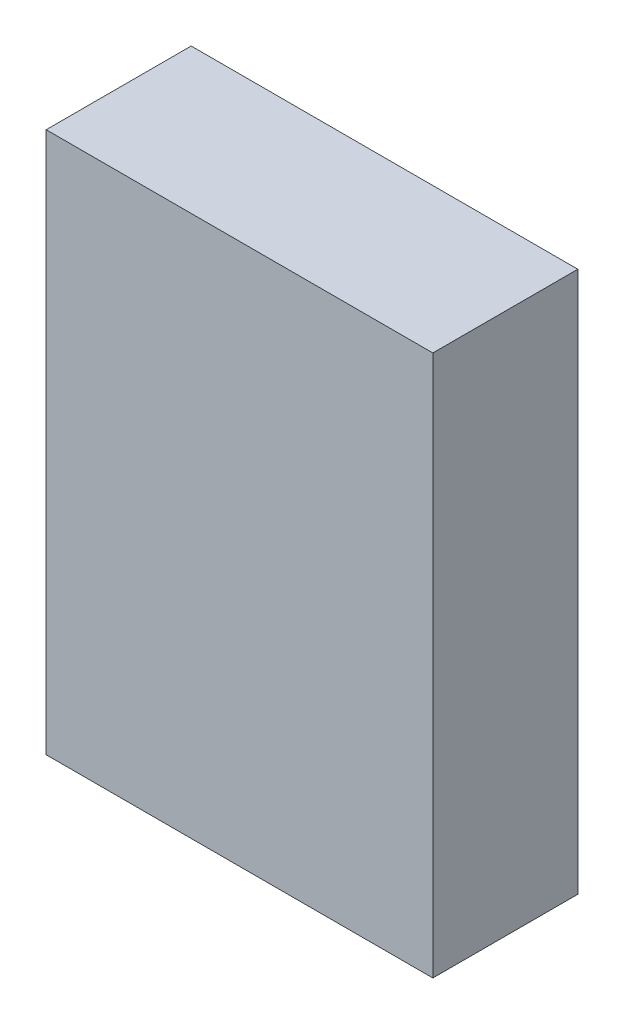
ISO-10303-21;
HEADER;
FILE_DESCRIPTION(('STEP AP214'),'2;1');
FILE_NAME('part.step','',(''),(''),'','','');
FILE_SCHEMA(('AUTOMOTIVE_DESIGN { 1 0 10303 214 1 1 1 1 }'));
ENDSEC;
DATA;
#1=APPLICATION_CONTEXT('core data for automotive mechanical design processes');
#2=APPLICATION_PROTOCOL_DEFINITION('international standard','automotive_design',2000,#1);
#3=PRODUCT_CONTEXT('',#1,'mechanical');
#4=PRODUCT('Part','Part','',(#3));
#5=PRODUCT_RELATED_PRODUCT_CATEGORY('part','',(#4));
#6=PRODUCT_DEFINITION_FORMATION('','',#4);
#7=PRODUCT_DEFINITION_CONTEXT('part definition',#1,'design');
#8=PRODUCT_DEFINITION('design','',#6,#7);
#9=PRODUCT_DEFINITION_SHAPE('','',#8);
#10=(LENGTH_UNIT() NAMED_UNIT(*) SI_UNIT(.MILLI.,.METRE.));
#11=(NAMED_UNIT(*) PLANE_ANGLE_UNIT() SI_UNIT($,.RADIAN.));
#12=(NAMED_UNIT(*) SI_UNIT($,.STERADIAN.) SOLID_ANGLE_UNIT());
#13=UNCERTAINTY_MEASURE_WITH_UNIT(LENGTH_MEASURE(1.E-05),#10,'distance_accuracy_value','');
#14=(GEOMETRIC_REPRESENTATION_CONTEXT(3) GLOBAL_UNCERTAINTY_ASSIGNED_CONTEXT((#13)) GLOBAL_UNIT_ASSIGNED_CONTEXT((#10,
#11,#12)) REPRESENTATION_CONTEXT('',''));
#15=CARTESIAN_POINT('',(0.,0.,0.));
#16=DIRECTION('',(0.,0.,1.));
#17=DIRECTION('',(1.,0.,0.));
#18=AXIS2_PLACEMENT_3D('',#15,#16,#17);
#19=CARTESIAN_POINT('',(11.6522019236003,-16.4030324770231,-0.164999176045936));
#20=CARTESIAN_POINT('',(11.6522018648521,-17.0750324770232,-0.164999234794013));
#21=CARTESIAN_POINT('',(11.6522019236003,-16.4030324927592,0.0150008239540631));
#22=CARTESIAN_POINT('',(11.6522018648521,-17.0750324927593,0.0150007652059859));
#23=(BOUNDED_SURFACE() B_SPLINE_SURFACE(1,1,((#19,#20),(#21,#22)),.UNSPECIFIED.,.F.,.F.,
.F.) B_SPLINE_SURFACE_WITH_KNOTS((2,2),(2,2),(-1.50000000000005E-05,0.000165),
(-0.000336000000000014,0.000336),
.UNSPECIFIED.) GEOMETRIC_REPRESENTATION_ITEM() RATIONAL_B_SPLINE_SURFACE(((1.,1.),(1.,1.))) REPRESENTATION_ITEM('') SURFACE());
#24=CARTESIAN_POINT('',(11.6522018697478,-17.0190324914479,7.70101659103158E-07));
#25=CARTESIAN_POINT('',(11.6522019187046,-16.4590324914479,8.19058390110066E-07));
#26=(BOUNDED_CURVE() B_SPLINE_CURVE(1,(#24,#25),.UNSPECIFIED.,.F.,
.F.) B_SPLINE_CURVE_WITH_KNOTS((2,2),(-0.00028,0.00028),
.UNSPECIFIED.) CURVE() GEOMETRIC_REPRESENTATION_ITEM() RATIONAL_B_SPLINE_CURVE((1.,1.)) REPRESENTATION_ITEM(''));
#27=CARTESIAN_POINT('',(11.6522018697479,-17.0190324914479,7.70101659091499E-07));
#28=VERTEX_POINT('',#27);
#29=CARTESIAN_POINT('',(11.6522019187046,-16.4590324914479,8.19058390121724E-07));
#30=VERTEX_POINT('',#29);
#31=EDGE_CURVE('E97',#28,#30,#26,.T.);
#32=CARTESIAN_POINT('',(11.6522018697479,-17.0190324783345,-0.14999922989834));
#33=CARTESIAN_POINT('',(11.6522018697479,-17.0190324914479,7.70101659056804E-07));
#34=(BOUNDED_CURVE() B_SPLINE_CURVE(1,(#32,#33),.UNSPECIFIED.,.F.,
.F.) B_SPLINE_CURVE_WITH_KNOTS((2,2),(0.,0.00015),
.UNSPECIFIED.) CURVE() GEOMETRIC_REPRESENTATION_ITEM() RATIONAL_B_SPLINE_CURVE((1.,1.)) REPRESENTATION_ITEM(''));
#35=CARTESIAN_POINT('',(11.6522018697479,-17.0190324783345,-0.14999922989834));
#36=VERTEX_POINT('',#35);
#37=EDGE_CURVE('E11',#36,#28,#34,.T.);
#38=CARTESIAN_POINT('',(11.6522018697478,-17.0190324783345,-0.149999229898339));
#39=CARTESIAN_POINT('',(11.6522019187046,-16.4590324783345,-0.149999180941608));
#40=(BOUNDED_CURVE() B_SPLINE_CURVE(1,(#38,#39),.UNSPECIFIED.,.F.,
.F.) B_SPLINE_CURVE_WITH_KNOTS((2,2),(-0.00028,0.00028),
.UNSPECIFIED.) CURVE() GEOMETRIC_REPRESENTATION_ITEM() RATIONAL_B_SPLINE_CURVE((1.,1.)) REPRESENTATION_ITEM(''));
#41=CARTESIAN_POINT('',(11.6522019187046,-16.4590324783345,-0.149999180941609));
#42=VERTEX_POINT('',#41);
#43=EDGE_CURVE('E78',#36,#42,#40,.T.);
#44=CARTESIAN_POINT('',(11.6522019187046,-16.4590324783345,-0.149999180941609));
#45=CARTESIAN_POINT('',(11.6522019187046,-16.4590324914479,8.19058390104377E-07));
#46=(BOUNDED_CURVE() B_SPLINE_CURVE(1,(#44,#45),.UNSPECIFIED.,.F.,
.F.) B_SPLINE_CURVE_WITH_KNOTS((2,2),(0.,0.00015),
.UNSPECIFIED.) CURVE() GEOMETRIC_REPRESENTATION_ITEM() RATIONAL_B_SPLINE_CURVE((1.,1.)) REPRESENTATION_ITEM(''));
#47=EDGE_CURVE('E22',#42,#30,#46,.T.);
#48=ORIENTED_EDGE('',*,*,#31,.F.);
#49=ORIENTED_EDGE('',*,*,#37,.F.);
#50=ORIENTED_EDGE('',*,*,#43,.T.);
#51=ORIENTED_EDGE('',*,*,#47,.T.);
#52=EDGE_LOOP('',(#48,#49,#50,#51));
#53=FACE_BOUND('',#52,.T.);
#54=ADVANCED_FACE('F17',(#53),#23,.T.);
#55=CARTESIAN_POINT('',(11.2122018697479,-17.0190324542932,0.0150007701016626));
#56=CARTESIAN_POINT('',(11.6922018697479,-17.0190324962561,0.015000770101659));
#57=CARTESIAN_POINT('',(11.2122018697479,-17.0190324385571,-0.164999229898337));
#58=CARTESIAN_POINT('',(11.6922018697479,-17.01903248052,-0.164999229898341));
#59=(BOUNDED_SURFACE() B_SPLINE_SURFACE(1,1,((#55,#56),(#57,#58)),.UNSPECIFIED.,.F.,.F.,
.F.) B_SPLINE_SURFACE_WITH_KNOTS((2,2),(2,2),(-1.5E-05,0.000165),(-0.000240000000000003,
0.00024),.UNSPECIFIED.) GEOMETRIC_REPRESENTATION_ITEM() RATIONAL_B_SPLINE_SURFACE(((1.,1.),(1.,1.))) REPRESENTATION_ITEM('') SURFACE());
#60=CARTESIAN_POINT('',(11.6522018697479,-17.019032491448,7.70101659297674E-07));
#61=CARTESIAN_POINT('',(11.2522018697479,-17.0190324564788,7.7010166235477E-07));
#62=(BOUNDED_CURVE() B_SPLINE_CURVE(1,(#60,#61),.UNSPECIFIED.,.F.,
.F.) B_SPLINE_CURVE_WITH_KNOTS((2,2),(-0.0002,0.0002),
.UNSPECIFIED.) CURVE() GEOMETRIC_REPRESENTATION_ITEM() RATIONAL_B_SPLINE_CURVE((1.,1.)) REPRESENTATION_ITEM(''));
#63=CARTESIAN_POINT('',(11.2522018697479,-17.0190324564788,7.70101662127265E-07));
#64=VERTEX_POINT('',#63);
#65=EDGE_CURVE('E84',#28,#64,#62,.T.);
#66=CARTESIAN_POINT('',(11.2522018697479,-17.0190324433654,-0.149999229898337));
#67=CARTESIAN_POINT('',(11.2522018697479,-17.0190324564788,7.70101662109918E-07));
#68=(BOUNDED_CURVE() B_SPLINE_CURVE(1,(#66,#67),.UNSPECIFIED.,.F.,
.F.) B_SPLINE_CURVE_WITH_KNOTS((2,2),(0.,0.00015),
.UNSPECIFIED.) CURVE() GEOMETRIC_REPRESENTATION_ITEM() RATIONAL_B_SPLINE_CURVE((1.,1.)) REPRESENTATION_ITEM(''));
#69=CARTESIAN_POINT('',(11.2522018697479,-17.0190324433654,-0.149999229898337));
#70=VERTEX_POINT('',#69);
#71=EDGE_CURVE('E31',#70,#64,#68,.T.);
#72=CARTESIAN_POINT('',(11.6522018697479,-17.0190324783345,-0.149999229898341));
#73=CARTESIAN_POINT('',(11.2522018697479,-17.0190324433653,-0.149999229898337));
#74=(BOUNDED_CURVE() B_SPLINE_CURVE(1,(#72,#73),.UNSPECIFIED.,.F.,
.F.) B_SPLINE_CURVE_WITH_KNOTS((2,2),(-0.0002,0.0002),
.UNSPECIFIED.) CURVE() GEOMETRIC_REPRESENTATION_ITEM() RATIONAL_B_SPLINE_CURVE((1.,1.)) REPRESENTATION_ITEM(''));
#75=EDGE_CURVE('E83',#36,#70,#74,.T.);
#76=ORIENTED_EDGE('',*,*,#65,.T.);
#77=ORIENTED_EDGE('',*,*,#71,.F.);
#78=ORIENTED_EDGE('',*,*,#75,.F.);
#79=ORIENTED_EDGE('',*,*,#37,.T.);
#80=EDGE_LOOP('',(#76,#77,#78,#79));
#81=FACE_BOUND('',#80,.T.);
#82=ADVANCED_FACE('F144',(#81),#59,.T.);
#83=CARTESIAN_POINT('',(11.2522019236003,-16.4030324577901,0.0150008239540662));
#84=CARTESIAN_POINT('',(11.2522018648521,-17.0750324577902,0.015000765205989));
#85=CARTESIAN_POINT('',(11.2522019236003,-16.4030324420541,-0.164999176045933));
#86=CARTESIAN_POINT('',(11.2522018648521,-17.0750324420541,-0.16499923479401));
#87=(BOUNDED_SURFACE() B_SPLINE_SURFACE(1,1,((#83,#84),(#85,#86)),.UNSPECIFIED.,.F.,.F.,
.F.) B_SPLINE_SURFACE_WITH_KNOTS((2,2),(2,2),(-1.50000000000005E-05,0.000165),
(-0.000336000000000012,0.000336000000000004),
.UNSPECIFIED.) GEOMETRIC_REPRESENTATION_ITEM() RATIONAL_B_SPLINE_SURFACE(((1.,1.),(1.,1.))) REPRESENTATION_ITEM('') SURFACE());
#88=CARTESIAN_POINT('',(11.2522018697478,-17.0190324564788,7.70101662138923E-07));
#89=CARTESIAN_POINT('',(11.2522019187046,-16.4590324564788,8.19058393145832E-07));
#90=(BOUNDED_CURVE() B_SPLINE_CURVE(1,(#88,#89),.UNSPECIFIED.,.F.,
.F.) B_SPLINE_CURVE_WITH_KNOTS((2,2),(-0.00028,0.00028),
.UNSPECIFIED.) CURVE() GEOMETRIC_REPRESENTATION_ITEM() RATIONAL_B_SPLINE_CURVE((1.,1.)) REPRESENTATION_ITEM(''));
#91=CARTESIAN_POINT('',(11.2522019187046,-16.4590324564788,8.1905839315749E-07));
#92=VERTEX_POINT('',#91);
#93=EDGE_CURVE('E92',#64,#92,#90,.T.);
#94=CARTESIAN_POINT('',(11.2522019187046,-16.4590324433654,-0.149999180941606));
#95=CARTESIAN_POINT('',(11.2522019187046,-16.4590324564788,8.19058393122796E-07));
#96=(BOUNDED_CURVE() B_SPLINE_CURVE(1,(#94,#95),.UNSPECIFIED.,.F.,
.F.) B_SPLINE_CURVE_WITH_KNOTS((2,2),(0.,0.00015),
.UNSPECIFIED.) CURVE() GEOMETRIC_REPRESENTATION_ITEM() RATIONAL_B_SPLINE_CURVE((1.,1.)) REPRESENTATION_ITEM(''));
#97=CARTESIAN_POINT('',(11.2522019187046,-16.4590324433654,-0.149999180941606));
#98=VERTEX_POINT('',#97);
#99=EDGE_CURVE('E40',#98,#92,#96,.T.);
#100=CARTESIAN_POINT('',(11.2522018697478,-17.0190324433654,-0.149999229898336));
#101=CARTESIAN_POINT('',(11.2522019187046,-16.4590324433654,-0.149999180941605));
#102=(BOUNDED_CURVE() B_SPLINE_CURVE(1,(#100,#101),.UNSPECIFIED.,.F.,
.F.) B_SPLINE_CURVE_WITH_KNOTS((2,2),(-0.00028,0.00028),
.UNSPECIFIED.) CURVE() GEOMETRIC_REPRESENTATION_ITEM() RATIONAL_B_SPLINE_CURVE((1.,1.)) REPRESENTATION_ITEM(''));
#103=EDGE_CURVE('E79',#70,#98,#102,.T.);
#104=ORIENTED_EDGE('',*,*,#93,.T.);
#105=ORIENTED_EDGE('',*,*,#99,.F.);
#106=ORIENTED_EDGE('',*,*,#103,.F.);
#107=ORIENTED_EDGE('',*,*,#71,.T.);
#108=EDGE_LOOP('',(#104,#105,#106,#107));
#109=FACE_BOUND('',#108,.T.);
#110=ADVANCED_FACE('F145',(#109),#87,.T.);
#111=CARTESIAN_POINT('',(11.2122019187046,-16.4590324385571,-0.164999180941606));
#112=CARTESIAN_POINT('',(11.6922019187046,-16.45903248052,-0.16499918094161));
#113=CARTESIAN_POINT('',(11.2122019187046,-16.4590324542932,0.0150008190583937));
#114=CARTESIAN_POINT('',(11.6922019187046,-16.4590324962561,0.01500081905839));
#115=(BOUNDED_SURFACE() B_SPLINE_SURFACE(1,1,((#111,#112),(#113,#114)),.UNSPECIFIED.,.F.,.F.,
.F.) B_SPLINE_SURFACE_WITH_KNOTS((2,2),(2,2),(-1.5E-05,0.000165),(-0.00024,0.00024),
.UNSPECIFIED.) GEOMETRIC_REPRESENTATION_ITEM() RATIONAL_B_SPLINE_SURFACE(((1.,1.),(1.,1.))) REPRESENTATION_ITEM('') SURFACE());
#116=CARTESIAN_POINT('',(11.6522019187046,-16.4590324914479,8.190583903279E-07));
#117=CARTESIAN_POINT('',(11.2522019187046,-16.4590324564787,8.19058393384996E-07));
#118=(BOUNDED_CURVE() B_SPLINE_CURVE(1,(#116,#117),.UNSPECIFIED.,.F.,
.F.) B_SPLINE_CURVE_WITH_KNOTS((2,2),(-0.0002,0.0002),
.UNSPECIFIED.) CURVE() GEOMETRIC_REPRESENTATION_ITEM() RATIONAL_B_SPLINE_CURVE((1.,1.)) REPRESENTATION_ITEM(''));
#119=EDGE_CURVE('E71',#30,#92,#118,.T.);
#120=CARTESIAN_POINT('',(11.6522019187046,-16.4590324783345,-0.14999918094161));
#121=CARTESIAN_POINT('',(11.2522019187046,-16.4590324433653,-0.149999180941606));
#122=(BOUNDED_CURVE() B_SPLINE_CURVE(1,(#120,#121),.UNSPECIFIED.,.F.,
.F.) B_SPLINE_CURVE_WITH_KNOTS((2,2),(-0.0002,0.0002),
.UNSPECIFIED.) CURVE() GEOMETRIC_REPRESENTATION_ITEM() RATIONAL_B_SPLINE_CURVE((1.,1.)) REPRESENTATION_ITEM(''));
#123=EDGE_CURVE('E68',#42,#98,#122,.T.);
#124=ORIENTED_EDGE('',*,*,#119,.F.);
#125=ORIENTED_EDGE('',*,*,#47,.F.);
#126=ORIENTED_EDGE('',*,*,#123,.T.);
#127=ORIENTED_EDGE('',*,*,#99,.T.);
#128=EDGE_LOOP('',(#124,#125,#126,#127));
#129=FACE_BOUND('',#128,.T.);
#130=ADVANCED_FACE('F67',(#129),#115,.T.);
#131=CARTESIAN_POINT('',(11.2122019236002,-16.4030324398684,-0.149999176045932));
#132=CARTESIAN_POINT('',(11.2122018648521,-17.0750324398685,-0.149999234794009));
#133=CARTESIAN_POINT('',(11.6922019236003,-16.4030324818314,-0.149999176045936));
#134=CARTESIAN_POINT('',(11.6922018648522,-17.0750324818314,-0.149999234794013));
#135=(BOUNDED_SURFACE() B_SPLINE_SURFACE(1,1,((#131,#132),(#133,#134)),.UNSPECIFIED.,.F.,.F.,
.F.) B_SPLINE_SURFACE_WITH_KNOTS((2,2),(2,2),(0.00166499999999994,0.00214500000000003),
(0.00243399999999992,0.003106),
.UNSPECIFIED.) GEOMETRIC_REPRESENTATION_ITEM() RATIONAL_B_SPLINE_SURFACE(((1.,1.),(1.,1.))) REPRESENTATION_ITEM('') SURFACE());
#136=ORIENTED_EDGE('',*,*,#43,.F.);
#137=ORIENTED_EDGE('',*,*,#75,.T.);
#138=ORIENTED_EDGE('',*,*,#103,.T.);
#139=ORIENTED_EDGE('',*,*,#123,.F.);
#140=EDGE_LOOP('',(#136,#137,#138,#139));
#141=FACE_BOUND('',#140,.T.);
#142=ADVANCED_FACE('F76',(#141),#135,.T.);
#143=CARTESIAN_POINT('',(11.6922019502643,-16.4030324765423,8.23954064587407E-07));
#144=CARTESIAN_POINT('',(11.6922018915162,-17.0750326973723,7.65205968073552E-07));
#145=CARTESIAN_POINT('',(11.2122016302968,-16.4030324345793,8.23954068255924E-07));
#146=CARTESIAN_POINT('',(11.2122015715487,-17.0750326554093,7.65205971742069E-07));
#147=(BOUNDED_SURFACE() B_SPLINE_SURFACE(1,1,((#143,#144),(#145,#146)),.UNSPECIFIED.,.F.,.F.,
.F.) B_SPLINE_SURFACE_WITH_KNOTS((2,2),(2,2),(0.00166499970669652,0.00214500002666398),
(0.00243399998159743,0.00310600020242746),
.UNSPECIFIED.) GEOMETRIC_REPRESENTATION_ITEM() RATIONAL_B_SPLINE_SURFACE(((1.,1.),(1.,1.))) REPRESENTATION_ITEM('') SURFACE());
#148=ORIENTED_EDGE('',*,*,#31,.T.);
#149=ORIENTED_EDGE('',*,*,#119,.T.);
#150=ORIENTED_EDGE('',*,*,#93,.F.);
#151=ORIENTED_EDGE('',*,*,#65,.F.);
#152=EDGE_LOOP('',(#148,#149,#150,#151));
#153=FACE_BOUND('',#152,.T.);
#154=ADVANCED_FACE('F143',(#153),#147,.T.);
#155=CLOSED_SHELL('',(#54,#82,#110,#130,#142,#154));
#156=MANIFOLD_SOLID_BREP('B1',#155);
#157=ADVANCED_BREP_SHAPE_REPRESENTATION('',(#18,#156),#14);
#158=SHAPE_DEFINITION_REPRESENTATION(#9,#157);
ENDSEC;
END-ISO-10303-21;
